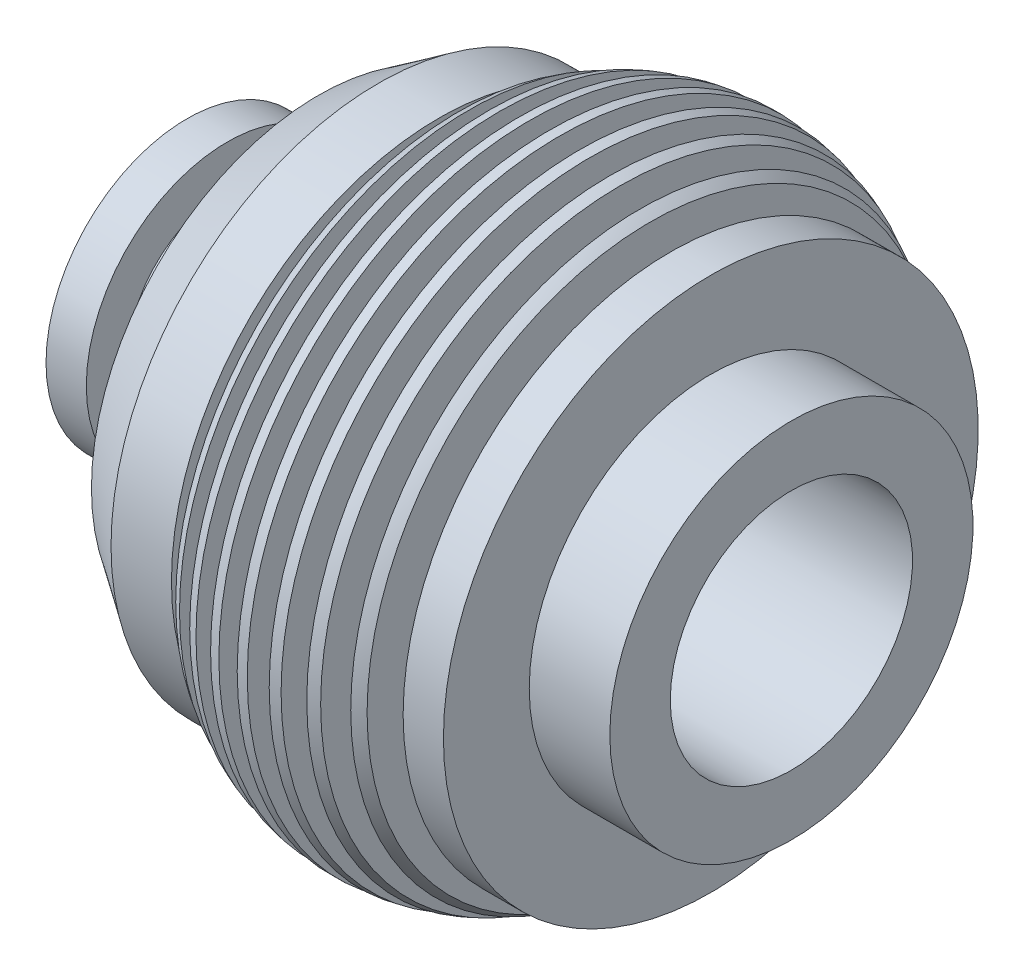
ISO-10303-21;
HEADER;
FILE_DESCRIPTION(('STEP AP214'),'2;1');
FILE_NAME('part.step','',(''),(''),'','','');
FILE_SCHEMA(('AUTOMOTIVE_DESIGN { 1 0 10303 214 1 1 1 1 }'));
ENDSEC;
DATA;
#1=APPLICATION_CONTEXT('core data for automotive mechanical design processes');
#2=APPLICATION_PROTOCOL_DEFINITION('international standard','automotive_design',2000,#1);
#3=PRODUCT_CONTEXT('',#1,'mechanical');
#4=PRODUCT('Part','Part','',(#3));
#5=PRODUCT_RELATED_PRODUCT_CATEGORY('part','',(#4));
#6=PRODUCT_DEFINITION_FORMATION('','',#4);
#7=PRODUCT_DEFINITION_CONTEXT('part definition',#1,'design');
#8=PRODUCT_DEFINITION('design','',#6,#7);
#9=PRODUCT_DEFINITION_SHAPE('','',#8);
#10=(LENGTH_UNIT() NAMED_UNIT(*) SI_UNIT(.MILLI.,.METRE.));
#11=(NAMED_UNIT(*) PLANE_ANGLE_UNIT() SI_UNIT($,.RADIAN.));
#12=(NAMED_UNIT(*) SI_UNIT($,.STERADIAN.) SOLID_ANGLE_UNIT());
#13=UNCERTAINTY_MEASURE_WITH_UNIT(LENGTH_MEASURE(1.E-05),#10,'distance_accuracy_value','');
#14=(GEOMETRIC_REPRESENTATION_CONTEXT(3) GLOBAL_UNCERTAINTY_ASSIGNED_CONTEXT((#13)) GLOBAL_UNIT_ASSIGNED_CONTEXT((#10,
#11,#12)) REPRESENTATION_CONTEXT('',''));
#15=CARTESIAN_POINT('',(0.,0.,0.));
#16=DIRECTION('',(0.,0.,1.));
#17=DIRECTION('',(1.,0.,0.));
#18=AXIS2_PLACEMENT_3D('',#15,#16,#17);
#19=CARTESIAN_POINT('',(41.25,-15.,0.));
#20=DIRECTION('',(-1.,0.,0.));
#21=DIRECTION('',(0.,0.,1.));
#22=AXIS2_PLACEMENT_3D('',#19,#20,#21);
#23=DEGENERATE_TOROIDAL_SURFACE('',#22,35.0655121986012,42.5,.T.);
#24=CARTESIAN_POINT('',(27.5,-15.,0.));
#25=DIRECTION('',(-1.,0.,0.));
#26=DIRECTION('',(0.,0.,1.));
#27=AXIS2_PLACEMENT_3D('',#24,#25,#26);
#28=CIRCLE('',#27,75.2797820539647);
#29=CARTESIAN_POINT('',(27.5,-15.,75.2797820539647));
#30=VERTEX_POINT('',#29);
#31=EDGE_CURVE('E173',#30,#30,#28,.T.);
#32=ORIENTED_EDGE('',*,*,#31,.T.);
#33=EDGE_LOOP('',(#32));
#34=FACE_BOUND('',#33,.T.);
#35=CARTESIAN_POINT('',(25.,-15.,0.));
#36=DIRECTION('',(-1.,0.,0.));
#37=DIRECTION('',(0.,0.,1.));
#38=AXIS2_PLACEMENT_3D('',#35,#36,#37);
#39=CIRCLE('',#38,74.3362073796137);
#40=CARTESIAN_POINT('',(25.,-15.,74.3362073796137));
#41=VERTEX_POINT('',#40);
#42=EDGE_CURVE('E10',#41,#41,#39,.T.);
#43=ORIENTED_EDGE('',*,*,#42,.F.);
#44=EDGE_LOOP('',(#43));
#45=FACE_BOUND('',#44,.T.);
#46=ADVANCED_FACE('F31',(#34,#45),#23,.T.);
#47=CARTESIAN_POINT('',(25.,0.,0.));
#48=DIRECTION('',(-1.,0.,0.));
#49=DIRECTION('',(0.,0.,1.));
#50=AXIS2_PLACEMENT_3D('',#47,#48,#49);
#51=PLANE('',#50);
#52=ORIENTED_EDGE('',*,*,#42,.T.);
#53=EDGE_LOOP('',(#52));
#54=FACE_BOUND('',#53,.T.);
#55=CARTESIAN_POINT('',(25.,-15.,0.));
#56=DIRECTION('',(-1.,0.,0.));
#57=DIRECTION('',(0.,0.,1.));
#58=AXIS2_PLACEMENT_3D('',#55,#56,#57);
#59=CIRCLE('',#58,50.0654722624735);
#60=CARTESIAN_POINT('',(25.,-15.,50.0654722624735));
#61=VERTEX_POINT('',#60);
#62=EDGE_CURVE('E37',#61,#61,#59,.T.);
#63=ORIENTED_EDGE('',*,*,#62,.F.);
#64=EDGE_LOOP('',(#63));
#65=FACE_BOUND('',#64,.T.);
#66=ADVANCED_FACE('F197',(#54,#65),#51,.T.);
#67=CARTESIAN_POINT('',(-50.,-15.,0.));
#68=DIRECTION('',(-1.,0.,0.));
#69=DIRECTION('',(0.,0.,1.));
#70=AXIS2_PLACEMENT_3D('',#67,#68,#69);
#71=CYLINDRICAL_SURFACE('',#70,50.0654722624735);
#72=ORIENTED_EDGE('',*,*,#62,.T.);
#73=EDGE_LOOP('',(#72));
#74=FACE_BOUND('',#73,.T.);
#75=CARTESIAN_POINT('',(20.,-15.,0.));
#76=DIRECTION('',(-1.,0.,0.));
#77=DIRECTION('',(0.,0.,1.));
#78=AXIS2_PLACEMENT_3D('',#75,#76,#77);
#79=CIRCLE('',#78,50.0654722624735);
#80=CARTESIAN_POINT('',(20.,-15.,50.0654722624735));
#81=VERTEX_POINT('',#80);
#82=EDGE_CURVE('E41',#81,#81,#79,.T.);
#83=ORIENTED_EDGE('',*,*,#82,.F.);
#84=EDGE_LOOP('',(#83));
#85=FACE_BOUND('',#84,.T.);
#86=ADVANCED_FACE('F201',(#74,#85),#71,.T.);
#87=CARTESIAN_POINT('',(20.,0.,0.));
#88=DIRECTION('',(-1.,0.,0.));
#89=DIRECTION('',(0.,0.,1.));
#90=AXIS2_PLACEMENT_3D('',#87,#88,#89);
#91=PLANE('',#90);
#92=CARTESIAN_POINT('',(20.,-15.,0.));
#93=DIRECTION('',(-1.,0.,0.));
#94=DIRECTION('',(0.,0.,1.));
#95=AXIS2_PLACEMENT_3D('',#92,#93,#94);
#96=CIRCLE('',#95,71.8715918594398);
#97=CARTESIAN_POINT('',(20.,-15.,71.8715918594398));
#98=VERTEX_POINT('',#97);
#99=EDGE_CURVE('E45',#98,#98,#96,.T.);
#100=ORIENTED_EDGE('',*,*,#99,.F.);
#101=EDGE_LOOP('',(#100));
#102=FACE_BOUND('',#101,.T.);
#103=ORIENTED_EDGE('',*,*,#82,.T.);
#104=EDGE_LOOP('',(#103));
#105=FACE_BOUND('',#104,.T.);
#106=ADVANCED_FACE('F205',(#102,#105),#91,.F.);
#107=CARTESIAN_POINT('',(41.25,-15.,0.));
#108=DIRECTION('',(-1.,0.,0.));
#109=DIRECTION('',(0.,0.,1.));
#110=AXIS2_PLACEMENT_3D('',#107,#108,#109);
#111=DEGENERATE_TOROIDAL_SURFACE('',#110,35.0655121986012,42.5,.T.);
#112=ORIENTED_EDGE('',*,*,#99,.T.);
#113=EDGE_LOOP('',(#112));
#114=FACE_BOUND('',#113,.T.);
#115=CARTESIAN_POINT('',(17.5,-15.,0.));
#116=DIRECTION('',(-1.,0.,0.));
#117=DIRECTION('',(0.,0.,1.));
#118=AXIS2_PLACEMENT_3D('',#115,#116,#117);
#119=CIRCLE('',#118,70.3101926482804);
#120=CARTESIAN_POINT('',(17.5,-15.,70.3101926482804));
#121=VERTEX_POINT('',#120);
#122=EDGE_CURVE('E50',#121,#121,#119,.T.);
#123=ORIENTED_EDGE('',*,*,#122,.F.);
#124=EDGE_LOOP('',(#123));
#125=FACE_BOUND('',#124,.T.);
#126=ADVANCED_FACE('F211',(#114,#125),#111,.T.);
#127=CARTESIAN_POINT('',(17.5,0.,0.));
#128=DIRECTION('',(-1.,0.,0.));
#129=DIRECTION('',(0.,0.,1.));
#130=AXIS2_PLACEMENT_3D('',#127,#128,#129);
#131=PLANE('',#130);
#132=ORIENTED_EDGE('',*,*,#122,.T.);
#133=EDGE_LOOP('',(#132));
#134=FACE_BOUND('',#133,.T.);
#135=CARTESIAN_POINT('',(17.5,-15.,0.));
#136=DIRECTION('',(-1.,0.,0.));
#137=DIRECTION('',(0.,0.,1.));
#138=AXIS2_PLACEMENT_3D('',#135,#136,#137);
#139=CIRCLE('',#138,50.0654722624735);
#140=CARTESIAN_POINT('',(17.5,-15.,50.0654722624735));
#141=VERTEX_POINT('',#140);
#142=EDGE_CURVE('E53',#141,#141,#139,.T.);
#143=ORIENTED_EDGE('',*,*,#142,.F.);
#144=EDGE_LOOP('',(#143));
#145=FACE_BOUND('',#144,.T.);
#146=ADVANCED_FACE('F215',(#134,#145),#131,.T.);
#147=CARTESIAN_POINT('',(-50.,-15.,0.));
#148=DIRECTION('',(-1.,0.,0.));
#149=DIRECTION('',(0.,0.,1.));
#150=AXIS2_PLACEMENT_3D('',#147,#148,#149);
#151=CYLINDRICAL_SURFACE('',#150,50.0654722624735);
#152=ORIENTED_EDGE('',*,*,#142,.T.);
#153=EDGE_LOOP('',(#152));
#154=FACE_BOUND('',#153,.T.);
#155=CARTESIAN_POINT('',(12.5,-15.,0.));
#156=DIRECTION('',(-1.,0.,0.));
#157=DIRECTION('',(0.,0.,1.));
#158=AXIS2_PLACEMENT_3D('',#155,#156,#157);
#159=CIRCLE('',#158,50.0654722624735);
#160=CARTESIAN_POINT('',(12.5,-15.,50.0654722624735));
#161=VERTEX_POINT('',#160);
#162=EDGE_CURVE('E56',#161,#161,#159,.T.);
#163=ORIENTED_EDGE('',*,*,#162,.F.);
#164=EDGE_LOOP('',(#163));
#165=FACE_BOUND('',#164,.T.);
#166=ADVANCED_FACE('F219',(#154,#165),#151,.T.);
#167=CARTESIAN_POINT('',(12.5,0.,0.));
#168=DIRECTION('',(1.,0.,0.));
#169=DIRECTION('',(0.,0.,-1.));
#170=AXIS2_PLACEMENT_3D('',#167,#168,#169);
#171=PLANE('',#170);
#172=ORIENTED_EDGE('',*,*,#162,.T.);
#173=EDGE_LOOP('',(#172));
#174=FACE_BOUND('',#173,.T.);
#175=CARTESIAN_POINT('',(12.5,-15.,0.));
#176=DIRECTION('',(-1.,0.,0.));
#177=DIRECTION('',(0.,0.,1.));
#178=AXIS2_PLACEMENT_3D('',#175,#176,#177);
#179=CIRCLE('',#178,66.3654722624735);
#180=CARTESIAN_POINT('',(12.5,-15.,66.3654722624735));
#181=VERTEX_POINT('',#180);
#182=EDGE_CURVE('E59',#181,#181,#179,.T.);
#183=ORIENTED_EDGE('',*,*,#182,.F.);
#184=EDGE_LOOP('',(#183));
#185=FACE_BOUND('',#184,.T.);
#186=ADVANCED_FACE('F223',(#174,#185),#171,.T.);
#187=CARTESIAN_POINT('',(-50.,-15.,0.));
#188=DIRECTION('',(-1.,0.,0.));
#189=DIRECTION('',(0.,0.,1.));
#190=AXIS2_PLACEMENT_3D('',#187,#188,#189);
#191=CYLINDRICAL_SURFACE('',#190,66.3654722624735);
#192=CARTESIAN_POINT('',(-2.5,-15.,0.));
#193=DIRECTION('',(-1.,0.,0.));
#194=DIRECTION('',(0.,0.,1.));
#195=AXIS2_PLACEMENT_3D('',#192,#193,#194);
#196=CIRCLE('',#195,66.3654722624735);
#197=CARTESIAN_POINT('',(-2.5,-15.,66.3654722624735));
#198=VERTEX_POINT('',#197);
#199=EDGE_CURVE('E62',#198,#198,#196,.T.);
#200=ORIENTED_EDGE('',*,*,#199,.F.);
#201=EDGE_LOOP('',(#200));
#202=FACE_BOUND('',#201,.T.);
#203=ORIENTED_EDGE('',*,*,#182,.T.);
#204=EDGE_LOOP('',(#203));
#205=FACE_BOUND('',#204,.T.);
#206=ADVANCED_FACE('F227',(#202,#205),#191,.T.);
#207=CARTESIAN_POINT('',(-2.5,-15.,0.));
#208=DIRECTION('',(1.,0.,0.));
#209=DIRECTION('',(0.,0.,-1.));
#210=AXIS2_PLACEMENT_3D('',#207,#208,#209);
#211=CONICAL_SURFACE('',#210,66.3654722624735,0.593411945678075);
#212=CARTESIAN_POINT('',(-17.4226763059907,-15.,0.));
#213=DIRECTION('',(-1.,0.,0.));
#214=DIRECTION('',(0.,0.,1.));
#215=AXIS2_PLACEMENT_3D('',#212,#213,#214);
#216=CIRCLE('',#215,56.3);
#217=CARTESIAN_POINT('',(-17.4226763059907,-15.,56.3));
#218=VERTEX_POINT('',#217);
#219=EDGE_CURVE('E65',#218,#218,#216,.T.);
#220=ORIENTED_EDGE('',*,*,#219,.F.);
#221=EDGE_LOOP('',(#220));
#222=FACE_BOUND('',#221,.T.);
#223=ORIENTED_EDGE('',*,*,#199,.T.);
#224=EDGE_LOOP('',(#223));
#225=FACE_BOUND('',#224,.T.);
#226=ADVANCED_FACE('F231',(#222,#225),#211,.T.);
#227=CARTESIAN_POINT('',(-17.4226763059907,0.,0.));
#228=DIRECTION('',(1.,0.,0.));
#229=DIRECTION('',(0.,0.,-1.));
#230=AXIS2_PLACEMENT_3D('',#227,#228,#229);
#231=PLANE('',#230);
#232=CARTESIAN_POINT('',(-17.4226763059907,-15.,0.));
#233=DIRECTION('',(-1.,0.,0.));
#234=DIRECTION('',(0.,0.,1.));
#235=AXIS2_PLACEMENT_3D('',#232,#233,#234);
#236=CIRCLE('',#235,35.);
#237=CARTESIAN_POINT('',(-17.4226763059907,-15.,35.));
#238=VERTEX_POINT('',#237);
#239=EDGE_CURVE('E68',#238,#238,#236,.T.);
#240=ORIENTED_EDGE('',*,*,#239,.F.);
#241=EDGE_LOOP('',(#240));
#242=FACE_BOUND('',#241,.T.);
#243=ORIENTED_EDGE('',*,*,#219,.T.);
#244=EDGE_LOOP('',(#243));
#245=FACE_BOUND('',#244,.T.);
#246=ADVANCED_FACE('F235',(#242,#245),#231,.F.);
#247=CARTESIAN_POINT('',(-27.4226763059907,-15.,0.));
#248=DIRECTION('',(-1.,0.,0.));
#249=DIRECTION('',(0.,0.,1.));
#250=AXIS2_PLACEMENT_3D('',#247,#248,#249);
#251=TOROIDAL_SURFACE('',#250,35.,10.);
#252=CARTESIAN_POINT('',(-27.4226763059907,-15.,0.));
#253=DIRECTION('',(-1.,0.,0.));
#254=DIRECTION('',(0.,0.,1.));
#255=AXIS2_PLACEMENT_3D('',#252,#253,#254);
#256=CIRCLE('',#255,25.);
#257=CARTESIAN_POINT('',(-27.4226763059907,-15.,25.));
#258=VERTEX_POINT('',#257);
#259=EDGE_CURVE('E71',#258,#258,#256,.T.);
#260=ORIENTED_EDGE('',*,*,#259,.F.);
#261=EDGE_LOOP('',(#260));
#262=FACE_BOUND('',#261,.T.);
#263=ORIENTED_EDGE('',*,*,#239,.T.);
#264=EDGE_LOOP('',(#263));
#265=FACE_BOUND('',#264,.T.);
#266=ADVANCED_FACE('F239',(#262,#265),#251,.F.);
#267=CARTESIAN_POINT('',(-50.,-15.,0.));
#268=DIRECTION('',(-1.,0.,0.));
#269=DIRECTION('',(0.,0.,1.));
#270=AXIS2_PLACEMENT_3D('',#267,#268,#269);
#271=CYLINDRICAL_SURFACE('',#270,25.);
#272=CARTESIAN_POINT('',(-40.,-15.,0.));
#273=DIRECTION('',(-1.,0.,0.));
#274=DIRECTION('',(0.,0.,1.));
#275=AXIS2_PLACEMENT_3D('',#272,#273,#274);
#276=CIRCLE('',#275,25.);
#277=CARTESIAN_POINT('',(-40.,-15.,25.));
#278=VERTEX_POINT('',#277);
#279=EDGE_CURVE('E74',#278,#278,#276,.T.);
#280=ORIENTED_EDGE('',*,*,#279,.F.);
#281=EDGE_LOOP('',(#280));
#282=FACE_BOUND('',#281,.T.);
#283=ORIENTED_EDGE('',*,*,#259,.T.);
#284=EDGE_LOOP('',(#283));
#285=FACE_BOUND('',#284,.T.);
#286=ADVANCED_FACE('F243',(#282,#285),#271,.T.);
#287=CARTESIAN_POINT('',(-40.,0.,0.));
#288=DIRECTION('',(1.,0.,0.));
#289=DIRECTION('',(0.,0.,-1.));
#290=AXIS2_PLACEMENT_3D('',#287,#288,#289);
#291=PLANE('',#290);
#292=ORIENTED_EDGE('',*,*,#279,.T.);
#293=EDGE_LOOP('',(#292));
#294=FACE_BOUND('',#293,.T.);
#295=CARTESIAN_POINT('',(-40.,-15.,0.));
#296=DIRECTION('',(-1.,0.,0.));
#297=DIRECTION('',(0.,0.,1.));
#298=AXIS2_PLACEMENT_3D('',#295,#296,#297);
#299=CIRCLE('',#298,35.);
#300=CARTESIAN_POINT('',(-40.,-15.,35.));
#301=VERTEX_POINT('',#300);
#302=EDGE_CURVE('E77',#301,#301,#299,.T.);
#303=ORIENTED_EDGE('',*,*,#302,.F.);
#304=EDGE_LOOP('',(#303));
#305=FACE_BOUND('',#304,.T.);
#306=ADVANCED_FACE('F247',(#294,#305),#291,.T.);
#307=CARTESIAN_POINT('',(-50.,-15.,0.));
#308=DIRECTION('',(-1.,0.,0.));
#309=DIRECTION('',(0.,0.,1.));
#310=AXIS2_PLACEMENT_3D('',#307,#308,#309);
#311=CYLINDRICAL_SURFACE('',#310,35.);
#312=CARTESIAN_POINT('',(-50.,-15.,0.));
#313=DIRECTION('',(-1.,0.,0.));
#314=DIRECTION('',(0.,0.,1.));
#315=AXIS2_PLACEMENT_3D('',#312,#313,#314);
#316=CIRCLE('',#315,35.);
#317=CARTESIAN_POINT('',(-50.,-15.,35.));
#318=VERTEX_POINT('',#317);
#319=EDGE_CURVE('E80',#318,#318,#316,.T.);
#320=ORIENTED_EDGE('',*,*,#319,.F.);
#321=EDGE_LOOP('',(#320));
#322=FACE_BOUND('',#321,.T.);
#323=ORIENTED_EDGE('',*,*,#302,.T.);
#324=EDGE_LOOP('',(#323));
#325=FACE_BOUND('',#324,.T.);
#326=ADVANCED_FACE('F251',(#322,#325),#311,.T.);
#327=CARTESIAN_POINT('',(-50.,0.,0.));
#328=DIRECTION('',(1.,0.,0.));
#329=DIRECTION('',(0.,0.,-1.));
#330=AXIS2_PLACEMENT_3D('',#327,#328,#329);
#331=PLANE('',#330);
#332=CARTESIAN_POINT('',(-50.,-15.,0.));
#333=DIRECTION('',(-1.,0.,0.));
#334=DIRECTION('',(0.,0.,1.));
#335=AXIS2_PLACEMENT_3D('',#332,#333,#334);
#336=CIRCLE('',#335,15.);
#337=CARTESIAN_POINT('',(-50.,-15.,15.));
#338=VERTEX_POINT('',#337);
#339=EDGE_CURVE('E83',#338,#338,#336,.T.);
#340=ORIENTED_EDGE('',*,*,#339,.F.);
#341=EDGE_LOOP('',(#340));
#342=FACE_BOUND('',#341,.T.);
#343=ORIENTED_EDGE('',*,*,#319,.T.);
#344=EDGE_LOOP('',(#343));
#345=FACE_BOUND('',#344,.T.);
#346=ADVANCED_FACE('F255',(#342,#345),#331,.F.);
#347=CARTESIAN_POINT('',(-50.,-15.,0.));
#348=DIRECTION('',(-1.,0.,0.));
#349=DIRECTION('',(0.,0.,1.));
#350=AXIS2_PLACEMENT_3D('',#347,#348,#349);
#351=CYLINDRICAL_SURFACE('',#350,15.);
#352=CARTESIAN_POINT('',(0.,-15.,0.));
#353=DIRECTION('',(-1.,0.,0.));
#354=DIRECTION('',(0.,0.,1.));
#355=AXIS2_PLACEMENT_3D('',#352,#353,#354);
#356=CIRCLE('',#355,15.);
#357=CARTESIAN_POINT('',(0.,-15.,15.));
#358=VERTEX_POINT('',#357);
#359=EDGE_CURVE('E86',#358,#358,#356,.T.);
#360=ORIENTED_EDGE('',*,*,#359,.F.);
#361=EDGE_LOOP('',(#360));
#362=FACE_BOUND('',#361,.T.);
#363=ORIENTED_EDGE('',*,*,#339,.T.);
#364=EDGE_LOOP('',(#363));
#365=FACE_BOUND('',#364,.T.);
#366=ADVANCED_FACE('F259',(#362,#365),#351,.F.);
#367=CARTESIAN_POINT('',(0.,0.,0.));
#368=DIRECTION('',(-1.,0.,0.));
#369=DIRECTION('',(0.,0.,1.));
#370=AXIS2_PLACEMENT_3D('',#367,#368,#369);
#371=PLANE('',#370);
#372=CARTESIAN_POINT('',(0.,-15.,0.));
#373=DIRECTION('',(-1.,0.,0.));
#374=DIRECTION('',(0.,0.,1.));
#375=AXIS2_PLACEMENT_3D('',#372,#373,#374);
#376=CIRCLE('',#375,30.0654722624735);
#377=CARTESIAN_POINT('',(0.,-15.,30.0654722624735));
#378=VERTEX_POINT('',#377);
#379=EDGE_CURVE('E89',#378,#378,#376,.T.);
#380=ORIENTED_EDGE('',*,*,#379,.F.);
#381=EDGE_LOOP('',(#380));
#382=FACE_BOUND('',#381,.T.);
#383=ORIENTED_EDGE('',*,*,#359,.T.);
#384=EDGE_LOOP('',(#383));
#385=FACE_BOUND('',#384,.T.);
#386=ADVANCED_FACE('F263',(#382,#385),#371,.F.);
#387=CARTESIAN_POINT('',(-50.,-15.,0.));
#388=DIRECTION('',(-1.,0.,0.));
#389=DIRECTION('',(0.,0.,1.));
#390=AXIS2_PLACEMENT_3D('',#387,#388,#389);
#391=CYLINDRICAL_SURFACE('',#390,30.0654722624735);
#392=CARTESIAN_POINT('',(100.,-15.,0.));
#393=DIRECTION('',(-1.,0.,0.));
#394=DIRECTION('',(0.,0.,1.));
#395=AXIS2_PLACEMENT_3D('',#392,#393,#394);
#396=CIRCLE('',#395,30.0654722624735);
#397=CARTESIAN_POINT('',(100.,-15.,30.0654722624735));
#398=VERTEX_POINT('',#397);
#399=EDGE_CURVE('E92',#398,#398,#396,.T.);
#400=ORIENTED_EDGE('',*,*,#399,.F.);
#401=EDGE_LOOP('',(#400));
#402=FACE_BOUND('',#401,.T.);
#403=ORIENTED_EDGE('',*,*,#379,.T.);
#404=EDGE_LOOP('',(#403));
#405=FACE_BOUND('',#404,.T.);
#406=ADVANCED_FACE('F267',(#402,#405),#391,.F.);
#407=CARTESIAN_POINT('',(100.,0.,0.));
#408=DIRECTION('',(-1.,0.,0.));
#409=DIRECTION('',(0.,0.,1.));
#410=AXIS2_PLACEMENT_3D('',#407,#408,#409);
#411=PLANE('',#410);
#412=CARTESIAN_POINT('',(100.,-15.,0.));
#413=DIRECTION('',(-1.,0.,0.));
#414=DIRECTION('',(0.,0.,1.));
#415=AXIS2_PLACEMENT_3D('',#412,#413,#414);
#416=CIRCLE('',#415,45.0654722624735);
#417=CARTESIAN_POINT('',(100.,-15.,45.0654722624735));
#418=VERTEX_POINT('',#417);
#419=EDGE_CURVE('E95',#418,#418,#416,.T.);
#420=ORIENTED_EDGE('',*,*,#419,.F.);
#421=EDGE_LOOP('',(#420));
#422=FACE_BOUND('',#421,.T.);
#423=ORIENTED_EDGE('',*,*,#399,.T.);
#424=EDGE_LOOP('',(#423));
#425=FACE_BOUND('',#424,.T.);
#426=ADVANCED_FACE('F271',(#422,#425),#411,.F.);
#427=CARTESIAN_POINT('',(-50.,-15.,0.));
#428=DIRECTION('',(-1.,0.,0.));
#429=DIRECTION('',(0.,0.,1.));
#430=AXIS2_PLACEMENT_3D('',#427,#428,#429);
#431=CYLINDRICAL_SURFACE('',#430,45.0654722624735);
#432=CARTESIAN_POINT('',(80.,-15.,0.));
#433=DIRECTION('',(-1.,0.,0.));
#434=DIRECTION('',(0.,0.,1.));
#435=AXIS2_PLACEMENT_3D('',#432,#433,#434);
#436=CIRCLE('',#435,45.0654722624735);
#437=CARTESIAN_POINT('',(80.,-15.,45.0654722624735));
#438=VERTEX_POINT('',#437);
#439=EDGE_CURVE('E98',#438,#438,#436,.T.);
#440=ORIENTED_EDGE('',*,*,#439,.F.);
#441=EDGE_LOOP('',(#440));
#442=FACE_BOUND('',#441,.T.);
#443=ORIENTED_EDGE('',*,*,#419,.T.);
#444=EDGE_LOOP('',(#443));
#445=FACE_BOUND('',#444,.T.);
#446=ADVANCED_FACE('F275',(#442,#445),#431,.T.);
#447=CARTESIAN_POINT('',(80.,0.,0.));
#448=DIRECTION('',(-1.,0.,0.));
#449=DIRECTION('',(0.,0.,1.));
#450=AXIS2_PLACEMENT_3D('',#447,#448,#449);
#451=PLANE('',#450);
#452=CARTESIAN_POINT('',(80.,-15.,0.));
#453=DIRECTION('',(-1.,0.,0.));
#454=DIRECTION('',(0.,0.,1.));
#455=AXIS2_PLACEMENT_3D('',#452,#453,#454);
#456=CIRCLE('',#455,66.3654722624735);
#457=CARTESIAN_POINT('',(80.,-15.,66.3654722624735));
#458=VERTEX_POINT('',#457);
#459=EDGE_CURVE('E101',#458,#458,#456,.T.);
#460=ORIENTED_EDGE('',*,*,#459,.F.);
#461=EDGE_LOOP('',(#460));
#462=FACE_BOUND('',#461,.T.);
#463=ORIENTED_EDGE('',*,*,#439,.T.);
#464=EDGE_LOOP('',(#463));
#465=FACE_BOUND('',#464,.T.);
#466=ADVANCED_FACE('F279',(#462,#465),#451,.F.);
#467=CARTESIAN_POINT('',(-50.,-15.,0.));
#468=DIRECTION('',(-1.,0.,0.));
#469=DIRECTION('',(0.,0.,1.));
#470=AXIS2_PLACEMENT_3D('',#467,#468,#469);
#471=CYLINDRICAL_SURFACE('',#470,66.3654722624735);
#472=CARTESIAN_POINT('',(70.,-15.,0.));
#473=DIRECTION('',(-1.,0.,0.));
#474=DIRECTION('',(0.,0.,1.));
#475=AXIS2_PLACEMENT_3D('',#472,#473,#474);
#476=CIRCLE('',#475,66.3654722624735);
#477=CARTESIAN_POINT('',(70.,-15.,66.3654722624735));
#478=VERTEX_POINT('',#477);
#479=EDGE_CURVE('E104',#478,#478,#476,.T.);
#480=ORIENTED_EDGE('',*,*,#479,.F.);
#481=EDGE_LOOP('',(#480));
#482=FACE_BOUND('',#481,.T.);
#483=ORIENTED_EDGE('',*,*,#459,.T.);
#484=EDGE_LOOP('',(#483));
#485=FACE_BOUND('',#484,.T.);
#486=ADVANCED_FACE('F283',(#482,#485),#471,.T.);
#487=CARTESIAN_POINT('',(70.,0.,0.));
#488=DIRECTION('',(-1.,0.,0.));
#489=DIRECTION('',(0.,0.,1.));
#490=AXIS2_PLACEMENT_3D('',#487,#488,#489);
#491=PLANE('',#490);
#492=ORIENTED_EDGE('',*,*,#479,.T.);
#493=EDGE_LOOP('',(#492));
#494=FACE_BOUND('',#493,.T.);
#495=CARTESIAN_POINT('',(70.,-15.,0.));
#496=DIRECTION('',(-1.,0.,0.));
#497=DIRECTION('',(0.,0.,1.));
#498=AXIS2_PLACEMENT_3D('',#495,#496,#497);
#499=CIRCLE('',#498,50.0654722624735);
#500=CARTESIAN_POINT('',(70.,-15.,50.0654722624735));
#501=VERTEX_POINT('',#500);
#502=EDGE_CURVE('E107',#501,#501,#499,.T.);
#503=ORIENTED_EDGE('',*,*,#502,.F.);
#504=EDGE_LOOP('',(#503));
#505=FACE_BOUND('',#504,.T.);
#506=ADVANCED_FACE('F287',(#494,#505),#491,.T.);
#507=CARTESIAN_POINT('',(-50.,-15.,0.));
#508=DIRECTION('',(-1.,0.,0.));
#509=DIRECTION('',(0.,0.,1.));
#510=AXIS2_PLACEMENT_3D('',#507,#508,#509);
#511=CYLINDRICAL_SURFACE('',#510,50.0654722624735);
#512=ORIENTED_EDGE('',*,*,#502,.T.);
#513=EDGE_LOOP('',(#512));
#514=FACE_BOUND('',#513,.T.);
#515=CARTESIAN_POINT('',(65.,-15.,0.));
#516=DIRECTION('',(-1.,0.,0.));
#517=DIRECTION('',(0.,0.,1.));
#518=AXIS2_PLACEMENT_3D('',#515,#516,#517);
#519=CIRCLE('',#518,50.0654722624735);
#520=CARTESIAN_POINT('',(65.,-15.,50.0654722624735));
#521=VERTEX_POINT('',#520);
#522=EDGE_CURVE('E110',#521,#521,#519,.T.);
#523=ORIENTED_EDGE('',*,*,#522,.F.);
#524=EDGE_LOOP('',(#523));
#525=FACE_BOUND('',#524,.T.);
#526=ADVANCED_FACE('F291',(#514,#525),#511,.T.);
#527=CARTESIAN_POINT('',(65.,0.,0.));
#528=DIRECTION('',(-1.,0.,0.));
#529=DIRECTION('',(0.,0.,1.));
#530=AXIS2_PLACEMENT_3D('',#527,#528,#529);
#531=PLANE('',#530);
#532=CARTESIAN_POINT('',(65.,-15.,0.));
#533=DIRECTION('',(-1.,0.,0.));
#534=DIRECTION('',(0.,0.,1.));
#535=AXIS2_PLACEMENT_3D('',#532,#533,#534);
#536=CIRCLE('',#535,70.3101926482804);
#537=CARTESIAN_POINT('',(65.,-15.,70.3101926482804));
#538=VERTEX_POINT('',#537);
#539=EDGE_CURVE('E113',#538,#538,#536,.T.);
#540=ORIENTED_EDGE('',*,*,#539,.F.);
#541=EDGE_LOOP('',(#540));
#542=FACE_BOUND('',#541,.T.);
#543=ORIENTED_EDGE('',*,*,#522,.T.);
#544=EDGE_LOOP('',(#543));
#545=FACE_BOUND('',#544,.T.);
#546=ADVANCED_FACE('F295',(#542,#545),#531,.F.);
#547=CARTESIAN_POINT('',(41.25,-15.,0.));
#548=DIRECTION('',(-1.,0.,0.));
#549=DIRECTION('',(0.,0.,1.));
#550=AXIS2_PLACEMENT_3D('',#547,#548,#549);
#551=DEGENERATE_TOROIDAL_SURFACE('',#550,35.0655121986012,42.5,.T.);
#552=ORIENTED_EDGE('',*,*,#539,.T.);
#553=EDGE_LOOP('',(#552));
#554=FACE_BOUND('',#553,.T.);
#555=CARTESIAN_POINT('',(62.5,-15.,0.));
#556=DIRECTION('',(-1.,0.,0.));
#557=DIRECTION('',(0.,0.,1.));
#558=AXIS2_PLACEMENT_3D('',#555,#556,#557);
#559=CIRCLE('',#558,71.8715918594398);
#560=CARTESIAN_POINT('',(62.5,-15.,71.8715918594398));
#561=VERTEX_POINT('',#560);
#562=EDGE_CURVE('E116',#561,#561,#559,.T.);
#563=ORIENTED_EDGE('',*,*,#562,.F.);
#564=EDGE_LOOP('',(#563));
#565=FACE_BOUND('',#564,.T.);
#566=ADVANCED_FACE('F299',(#554,#565),#551,.T.);
#567=CARTESIAN_POINT('',(62.5,0.,0.));
#568=DIRECTION('',(-1.,0.,0.));
#569=DIRECTION('',(0.,0.,1.));
#570=AXIS2_PLACEMENT_3D('',#567,#568,#569);
#571=PLANE('',#570);
#572=ORIENTED_EDGE('',*,*,#562,.T.);
#573=EDGE_LOOP('',(#572));
#574=FACE_BOUND('',#573,.T.);
#575=CARTESIAN_POINT('',(62.5,-15.,0.));
#576=DIRECTION('',(-1.,0.,0.));
#577=DIRECTION('',(0.,0.,1.));
#578=AXIS2_PLACEMENT_3D('',#575,#576,#577);
#579=CIRCLE('',#578,50.0654722624735);
#580=CARTESIAN_POINT('',(62.5,-15.,50.0654722624735));
#581=VERTEX_POINT('',#580);
#582=EDGE_CURVE('E119',#581,#581,#579,.T.);
#583=ORIENTED_EDGE('',*,*,#582,.F.);
#584=EDGE_LOOP('',(#583));
#585=FACE_BOUND('',#584,.T.);
#586=ADVANCED_FACE('F303',(#574,#585),#571,.T.);
#587=CARTESIAN_POINT('',(-50.,-15.,0.));
#588=DIRECTION('',(-1.,0.,0.));
#589=DIRECTION('',(0.,0.,1.));
#590=AXIS2_PLACEMENT_3D('',#587,#588,#589);
#591=CYLINDRICAL_SURFACE('',#590,50.0654722624735);
#592=ORIENTED_EDGE('',*,*,#582,.T.);
#593=EDGE_LOOP('',(#592));
#594=FACE_BOUND('',#593,.T.);
#595=CARTESIAN_POINT('',(57.5,-15.,0.));
#596=DIRECTION('',(-1.,0.,0.));
#597=DIRECTION('',(0.,0.,1.));
#598=AXIS2_PLACEMENT_3D('',#595,#596,#597);
#599=CIRCLE('',#598,50.0654722624735);
#600=CARTESIAN_POINT('',(57.5,-15.,50.0654722624735));
#601=VERTEX_POINT('',#600);
#602=EDGE_CURVE('E122',#601,#601,#599,.T.);
#603=ORIENTED_EDGE('',*,*,#602,.F.);
#604=EDGE_LOOP('',(#603));
#605=FACE_BOUND('',#604,.T.);
#606=ADVANCED_FACE('F307',(#594,#605),#591,.T.);
#607=CARTESIAN_POINT('',(57.5,0.,0.));
#608=DIRECTION('',(-1.,0.,0.));
#609=DIRECTION('',(0.,0.,1.));
#610=AXIS2_PLACEMENT_3D('',#607,#608,#609);
#611=PLANE('',#610);
#612=CARTESIAN_POINT('',(57.5,-15.,0.));
#613=DIRECTION('',(-1.,0.,0.));
#614=DIRECTION('',(0.,0.,1.));
#615=AXIS2_PLACEMENT_3D('',#612,#613,#614);
#616=CIRCLE('',#615,74.3362073796137);
#617=CARTESIAN_POINT('',(57.5,-15.,74.3362073796137));
#618=VERTEX_POINT('',#617);
#619=EDGE_CURVE('E125',#618,#618,#616,.T.);
#620=ORIENTED_EDGE('',*,*,#619,.F.);
#621=EDGE_LOOP('',(#620));
#622=FACE_BOUND('',#621,.T.);
#623=ORIENTED_EDGE('',*,*,#602,.T.);
#624=EDGE_LOOP('',(#623));
#625=FACE_BOUND('',#624,.T.);
#626=ADVANCED_FACE('F311',(#622,#625),#611,.F.);
#627=CARTESIAN_POINT('',(41.25,-15.,0.));
#628=DIRECTION('',(-1.,0.,0.));
#629=DIRECTION('',(0.,0.,1.));
#630=AXIS2_PLACEMENT_3D('',#627,#628,#629);
#631=DEGENERATE_TOROIDAL_SURFACE('',#630,35.0655121986012,42.5,.T.);
#632=ORIENTED_EDGE('',*,*,#619,.T.);
#633=EDGE_LOOP('',(#632));
#634=FACE_BOUND('',#633,.T.);
#635=CARTESIAN_POINT('',(55.,-15.,0.));
#636=DIRECTION('',(-1.,0.,0.));
#637=DIRECTION('',(0.,0.,1.));
#638=AXIS2_PLACEMENT_3D('',#635,#636,#637);
#639=CIRCLE('',#638,75.2797820539647);
#640=CARTESIAN_POINT('',(55.,-15.,75.2797820539647));
#641=VERTEX_POINT('',#640);
#642=EDGE_CURVE('E128',#641,#641,#639,.T.);
#643=ORIENTED_EDGE('',*,*,#642,.F.);
#644=EDGE_LOOP('',(#643));
#645=FACE_BOUND('',#644,.T.);
#646=ADVANCED_FACE('F315',(#634,#645),#631,.T.);
#647=CARTESIAN_POINT('',(55.,0.,0.));
#648=DIRECTION('',(-1.,0.,0.));
#649=DIRECTION('',(0.,0.,1.));
#650=AXIS2_PLACEMENT_3D('',#647,#648,#649);
#651=PLANE('',#650);
#652=ORIENTED_EDGE('',*,*,#642,.T.);
#653=EDGE_LOOP('',(#652));
#654=FACE_BOUND('',#653,.T.);
#655=CARTESIAN_POINT('',(55.,-15.,0.));
#656=DIRECTION('',(-1.,0.,0.));
#657=DIRECTION('',(0.,0.,1.));
#658=AXIS2_PLACEMENT_3D('',#655,#656,#657);
#659=CIRCLE('',#658,50.0654722624735);
#660=CARTESIAN_POINT('',(55.,-15.,50.0654722624735));
#661=VERTEX_POINT('',#660);
#662=EDGE_CURVE('E131',#661,#661,#659,.T.);
#663=ORIENTED_EDGE('',*,*,#662,.F.);
#664=EDGE_LOOP('',(#663));
#665=FACE_BOUND('',#664,.T.);
#666=ADVANCED_FACE('F319',(#654,#665),#651,.T.);
#667=CARTESIAN_POINT('',(-50.,-15.,0.));
#668=DIRECTION('',(-1.,0.,0.));
#669=DIRECTION('',(0.,0.,1.));
#670=AXIS2_PLACEMENT_3D('',#667,#668,#669);
#671=CYLINDRICAL_SURFACE('',#670,50.0654722624735);
#672=ORIENTED_EDGE('',*,*,#662,.T.);
#673=EDGE_LOOP('',(#672));
#674=FACE_BOUND('',#673,.T.);
#675=CARTESIAN_POINT('',(50.,-15.,0.));
#676=DIRECTION('',(-1.,0.,0.));
#677=DIRECTION('',(0.,0.,1.));
#678=AXIS2_PLACEMENT_3D('',#675,#676,#677);
#679=CIRCLE('',#678,50.0654722624735);
#680=CARTESIAN_POINT('',(50.,-15.,50.0654722624735));
#681=VERTEX_POINT('',#680);
#682=EDGE_CURVE('E134',#681,#681,#679,.T.);
#683=ORIENTED_EDGE('',*,*,#682,.F.);
#684=EDGE_LOOP('',(#683));
#685=FACE_BOUND('',#684,.T.);
#686=ADVANCED_FACE('F323',(#674,#685),#671,.T.);
#687=CARTESIAN_POINT('',(50.,0.,0.));
#688=DIRECTION('',(-1.,0.,0.));
#689=DIRECTION('',(0.,0.,1.));
#690=AXIS2_PLACEMENT_3D('',#687,#688,#689);
#691=PLANE('',#690);
#692=CARTESIAN_POINT('',(50.,-15.,0.));
#693=DIRECTION('',(-1.,0.,0.));
#694=DIRECTION('',(0.,0.,1.));
#695=AXIS2_PLACEMENT_3D('',#692,#693,#694);
#696=CIRCLE('',#695,76.6550240976365);
#697=CARTESIAN_POINT('',(50.,-15.,76.6550240976365));
#698=VERTEX_POINT('',#697);
#699=EDGE_CURVE('E137',#698,#698,#696,.T.);
#700=ORIENTED_EDGE('',*,*,#699,.F.);
#701=EDGE_LOOP('',(#700));
#702=FACE_BOUND('',#701,.T.);
#703=ORIENTED_EDGE('',*,*,#682,.T.);
#704=EDGE_LOOP('',(#703));
#705=FACE_BOUND('',#704,.T.);
#706=ADVANCED_FACE('F327',(#702,#705),#691,.F.);
#707=CARTESIAN_POINT('',(41.25,-15.,0.));
#708=DIRECTION('',(-1.,0.,0.));
#709=DIRECTION('',(0.,0.,1.));
#710=AXIS2_PLACEMENT_3D('',#707,#708,#709);
#711=DEGENERATE_TOROIDAL_SURFACE('',#710,35.0655121986012,42.5,.T.);
#712=ORIENTED_EDGE('',*,*,#699,.T.);
#713=EDGE_LOOP('',(#712));
#714=FACE_BOUND('',#713,.T.);
#715=CARTESIAN_POINT('',(47.5,-15.,0.));
#716=DIRECTION('',(-1.,0.,0.));
#717=DIRECTION('',(0.,0.,1.));
#718=AXIS2_PLACEMENT_3D('',#715,#716,#717);
#719=CIRCLE('',#718,77.1034415006018);
#720=CARTESIAN_POINT('',(47.5,-15.,77.1034415006018));
#721=VERTEX_POINT('',#720);
#722=EDGE_CURVE('E140',#721,#721,#719,.T.);
#723=ORIENTED_EDGE('',*,*,#722,.F.);
#724=EDGE_LOOP('',(#723));
#725=FACE_BOUND('',#724,.T.);
#726=ADVANCED_FACE('F331',(#714,#725),#711,.T.);
#727=CARTESIAN_POINT('',(47.5,0.,0.));
#728=DIRECTION('',(-1.,0.,0.));
#729=DIRECTION('',(0.,0.,1.));
#730=AXIS2_PLACEMENT_3D('',#727,#728,#729);
#731=PLANE('',#730);
#732=ORIENTED_EDGE('',*,*,#722,.T.);
#733=EDGE_LOOP('',(#732));
#734=FACE_BOUND('',#733,.T.);
#735=CARTESIAN_POINT('',(47.5,-15.,0.));
#736=DIRECTION('',(-1.,0.,0.));
#737=DIRECTION('',(0.,0.,1.));
#738=AXIS2_PLACEMENT_3D('',#735,#736,#737);
#739=CIRCLE('',#738,50.0654722624735);
#740=CARTESIAN_POINT('',(47.5,-15.,50.0654722624735));
#741=VERTEX_POINT('',#740);
#742=EDGE_CURVE('E143',#741,#741,#739,.T.);
#743=ORIENTED_EDGE('',*,*,#742,.F.);
#744=EDGE_LOOP('',(#743));
#745=FACE_BOUND('',#744,.T.);
#746=ADVANCED_FACE('F335',(#734,#745),#731,.T.);
#747=CARTESIAN_POINT('',(-50.,-15.,0.));
#748=DIRECTION('',(-1.,0.,0.));
#749=DIRECTION('',(0.,0.,1.));
#750=AXIS2_PLACEMENT_3D('',#747,#748,#749);
#751=CYLINDRICAL_SURFACE('',#750,50.0654722624735);
#752=ORIENTED_EDGE('',*,*,#742,.T.);
#753=EDGE_LOOP('',(#752));
#754=FACE_BOUND('',#753,.T.);
#755=CARTESIAN_POINT('',(42.5,-15.,0.));
#756=DIRECTION('',(-1.,0.,0.));
#757=DIRECTION('',(0.,0.,1.));
#758=AXIS2_PLACEMENT_3D('',#755,#756,#757);
#759=CIRCLE('',#758,50.0654722624735);
#760=CARTESIAN_POINT('',(42.5,-15.,50.0654722624735));
#761=VERTEX_POINT('',#760);
#762=EDGE_CURVE('E146',#761,#761,#759,.T.);
#763=ORIENTED_EDGE('',*,*,#762,.F.);
#764=EDGE_LOOP('',(#763));
#765=FACE_BOUND('',#764,.T.);
#766=ADVANCED_FACE('F339',(#754,#765),#751,.T.);
#767=CARTESIAN_POINT('',(42.5,0.,0.));
#768=DIRECTION('',(-1.,0.,0.));
#769=DIRECTION('',(0.,0.,1.));
#770=AXIS2_PLACEMENT_3D('',#767,#768,#769);
#771=PLANE('',#770);
#772=CARTESIAN_POINT('',(42.5,-15.,0.));
#773=DIRECTION('',(-1.,0.,0.));
#774=DIRECTION('',(0.,0.,1.));
#775=AXIS2_PLACEMENT_3D('',#772,#773,#774);
#776=CIRCLE('',#775,77.5471258685173);
#777=CARTESIAN_POINT('',(42.5,-15.,77.5471258685173));
#778=VERTEX_POINT('',#777);
#779=EDGE_CURVE('E149',#778,#778,#776,.T.);
#780=ORIENTED_EDGE('',*,*,#779,.F.);
#781=EDGE_LOOP('',(#780));
#782=FACE_BOUND('',#781,.T.);
#783=ORIENTED_EDGE('',*,*,#762,.T.);
#784=EDGE_LOOP('',(#783));
#785=FACE_BOUND('',#784,.T.);
#786=ADVANCED_FACE('F343',(#782,#785),#771,.F.);
#787=CARTESIAN_POINT('',(41.25,-15.,0.));
#788=DIRECTION('',(-1.,0.,0.));
#789=DIRECTION('',(0.,0.,1.));
#790=AXIS2_PLACEMENT_3D('',#787,#788,#789);
#791=DEGENERATE_TOROIDAL_SURFACE('',#790,35.0655121986012,42.5,.T.);
#792=ORIENTED_EDGE('',*,*,#779,.T.);
#793=EDGE_LOOP('',(#792));
#794=FACE_BOUND('',#793,.T.);
#795=CARTESIAN_POINT('',(40.,-15.,0.));
#796=DIRECTION('',(-1.,0.,0.));
#797=DIRECTION('',(0.,0.,1.));
#798=AXIS2_PLACEMENT_3D('',#795,#796,#797);
#799=CIRCLE('',#798,77.5471258685173);
#800=CARTESIAN_POINT('',(40.,-15.,77.5471258685173));
#801=VERTEX_POINT('',#800);
#802=EDGE_CURVE('E152',#801,#801,#799,.T.);
#803=ORIENTED_EDGE('',*,*,#802,.F.);
#804=EDGE_LOOP('',(#803));
#805=FACE_BOUND('',#804,.T.);
#806=ADVANCED_FACE('F347',(#794,#805),#791,.T.);
#807=CARTESIAN_POINT('',(40.,0.,0.));
#808=DIRECTION('',(-1.,0.,0.));
#809=DIRECTION('',(0.,0.,1.));
#810=AXIS2_PLACEMENT_3D('',#807,#808,#809);
#811=PLANE('',#810);
#812=ORIENTED_EDGE('',*,*,#802,.T.);
#813=EDGE_LOOP('',(#812));
#814=FACE_BOUND('',#813,.T.);
#815=CARTESIAN_POINT('',(40.,-15.,0.));
#816=DIRECTION('',(-1.,0.,0.));
#817=DIRECTION('',(0.,0.,1.));
#818=AXIS2_PLACEMENT_3D('',#815,#816,#817);
#819=CIRCLE('',#818,50.0654722624735);
#820=CARTESIAN_POINT('',(40.,-15.,50.0654722624735));
#821=VERTEX_POINT('',#820);
#822=EDGE_CURVE('E155',#821,#821,#819,.T.);
#823=ORIENTED_EDGE('',*,*,#822,.F.);
#824=EDGE_LOOP('',(#823));
#825=FACE_BOUND('',#824,.T.);
#826=ADVANCED_FACE('F351',(#814,#825),#811,.T.);
#827=CARTESIAN_POINT('',(-50.,-15.,0.));
#828=DIRECTION('',(-1.,0.,0.));
#829=DIRECTION('',(0.,0.,1.));
#830=AXIS2_PLACEMENT_3D('',#827,#828,#829);
#831=CYLINDRICAL_SURFACE('',#830,50.0654722624735);
#832=ORIENTED_EDGE('',*,*,#822,.T.);
#833=EDGE_LOOP('',(#832));
#834=FACE_BOUND('',#833,.T.);
#835=CARTESIAN_POINT('',(35.,-15.,0.));
#836=DIRECTION('',(-1.,0.,0.));
#837=DIRECTION('',(0.,0.,1.));
#838=AXIS2_PLACEMENT_3D('',#835,#836,#837);
#839=CIRCLE('',#838,50.0654722624735);
#840=CARTESIAN_POINT('',(35.,-15.,50.0654722624735));
#841=VERTEX_POINT('',#840);
#842=EDGE_CURVE('E158',#841,#841,#839,.T.);
#843=ORIENTED_EDGE('',*,*,#842,.F.);
#844=EDGE_LOOP('',(#843));
#845=FACE_BOUND('',#844,.T.);
#846=ADVANCED_FACE('F355',(#834,#845),#831,.T.);
#847=CARTESIAN_POINT('',(35.,0.,0.));
#848=DIRECTION('',(-1.,0.,0.));
#849=DIRECTION('',(0.,0.,1.));
#850=AXIS2_PLACEMENT_3D('',#847,#848,#849);
#851=PLANE('',#850);
#852=CARTESIAN_POINT('',(35.,-15.,0.));
#853=DIRECTION('',(-1.,0.,0.));
#854=DIRECTION('',(0.,0.,1.));
#855=AXIS2_PLACEMENT_3D('',#852,#853,#854);
#856=CIRCLE('',#855,77.1034415006018);
#857=CARTESIAN_POINT('',(35.,-15.,77.1034415006018));
#858=VERTEX_POINT('',#857);
#859=EDGE_CURVE('E161',#858,#858,#856,.T.);
#860=ORIENTED_EDGE('',*,*,#859,.F.);
#861=EDGE_LOOP('',(#860));
#862=FACE_BOUND('',#861,.T.);
#863=ORIENTED_EDGE('',*,*,#842,.T.);
#864=EDGE_LOOP('',(#863));
#865=FACE_BOUND('',#864,.T.);
#866=ADVANCED_FACE('F359',(#862,#865),#851,.F.);
#867=CARTESIAN_POINT('',(41.25,-15.,0.));
#868=DIRECTION('',(-1.,0.,0.));
#869=DIRECTION('',(0.,0.,1.));
#870=AXIS2_PLACEMENT_3D('',#867,#868,#869);
#871=DEGENERATE_TOROIDAL_SURFACE('',#870,35.0655121986012,42.5,.T.);
#872=ORIENTED_EDGE('',*,*,#859,.T.);
#873=EDGE_LOOP('',(#872));
#874=FACE_BOUND('',#873,.T.);
#875=CARTESIAN_POINT('',(32.5,-15.,0.));
#876=DIRECTION('',(-1.,0.,0.));
#877=DIRECTION('',(0.,0.,1.));
#878=AXIS2_PLACEMENT_3D('',#875,#876,#877);
#879=CIRCLE('',#878,76.6550240976365);
#880=CARTESIAN_POINT('',(32.5,-15.,76.6550240976365));
#881=VERTEX_POINT('',#880);
#882=EDGE_CURVE('E164',#881,#881,#879,.T.);
#883=ORIENTED_EDGE('',*,*,#882,.F.);
#884=EDGE_LOOP('',(#883));
#885=FACE_BOUND('',#884,.T.);
#886=ADVANCED_FACE('F193',(#874,#885),#871,.T.);
#887=CARTESIAN_POINT('',(32.5,0.,0.));
#888=DIRECTION('',(-1.,0.,0.));
#889=DIRECTION('',(0.,0.,1.));
#890=AXIS2_PLACEMENT_3D('',#887,#888,#889);
#891=PLANE('',#890);
#892=ORIENTED_EDGE('',*,*,#882,.T.);
#893=EDGE_LOOP('',(#892));
#894=FACE_BOUND('',#893,.T.);
#895=CARTESIAN_POINT('',(32.5,-15.,0.));
#896=DIRECTION('',(-1.,0.,0.));
#897=DIRECTION('',(0.,0.,1.));
#898=AXIS2_PLACEMENT_3D('',#895,#896,#897);
#899=CIRCLE('',#898,50.0654722624735);
#900=CARTESIAN_POINT('',(32.5,-15.,50.0654722624735));
#901=VERTEX_POINT('',#900);
#902=EDGE_CURVE('E167',#901,#901,#899,.T.);
#903=ORIENTED_EDGE('',*,*,#902,.F.);
#904=EDGE_LOOP('',(#903));
#905=FACE_BOUND('',#904,.T.);
#906=ADVANCED_FACE('F187',(#894,#905),#891,.T.);
#907=CARTESIAN_POINT('',(-50.,-15.,0.));
#908=DIRECTION('',(-1.,0.,0.));
#909=DIRECTION('',(0.,0.,1.));
#910=AXIS2_PLACEMENT_3D('',#907,#908,#909);
#911=CYLINDRICAL_SURFACE('',#910,50.0654722624735);
#912=ORIENTED_EDGE('',*,*,#902,.T.);
#913=EDGE_LOOP('',(#912));
#914=FACE_BOUND('',#913,.T.);
#915=CARTESIAN_POINT('',(27.5,-15.,0.));
#916=DIRECTION('',(-1.,0.,0.));
#917=DIRECTION('',(0.,0.,1.));
#918=AXIS2_PLACEMENT_3D('',#915,#916,#917);
#919=CIRCLE('',#918,50.0654722624735);
#920=CARTESIAN_POINT('',(27.5,-15.,50.0654722624735));
#921=VERTEX_POINT('',#920);
#922=EDGE_CURVE('E170',#921,#921,#919,.T.);
#923=ORIENTED_EDGE('',*,*,#922,.F.);
#924=EDGE_LOOP('',(#923));
#925=FACE_BOUND('',#924,.T.);
#926=ADVANCED_FACE('F182',(#914,#925),#911,.T.);
#927=CARTESIAN_POINT('',(27.5,0.,0.));
#928=DIRECTION('',(-1.,0.,0.));
#929=DIRECTION('',(0.,0.,1.));
#930=AXIS2_PLACEMENT_3D('',#927,#928,#929);
#931=PLANE('',#930);
#932=ORIENTED_EDGE('',*,*,#31,.F.);
#933=EDGE_LOOP('',(#932));
#934=FACE_BOUND('',#933,.T.);
#935=ORIENTED_EDGE('',*,*,#922,.T.);
#936=EDGE_LOOP('',(#935));
#937=FACE_BOUND('',#936,.T.);
#938=ADVANCED_FACE('F179',(#934,#937),#931,.F.);
#939=CLOSED_SHELL('',(#46,#66,#86,#106,#126,#146,#166,#186,#206,#226,#246,#266,#286,#306,#326,
#346,#366,#386,#406,#426,#446,#466,#486,#506,#526,#546,#566,#586,#606,#626,#646,#666,#686,#706,
#726,#746,#766,#786,#806,#826,#846,#866,#886,#906,#926,#938));
#940=MANIFOLD_SOLID_BREP('B2',#939);
#941=ADVANCED_BREP_SHAPE_REPRESENTATION('',(#18,#940),#14);
#942=SHAPE_DEFINITION_REPRESENTATION(#9,#941);
ENDSEC;
END-ISO-10303-21;
